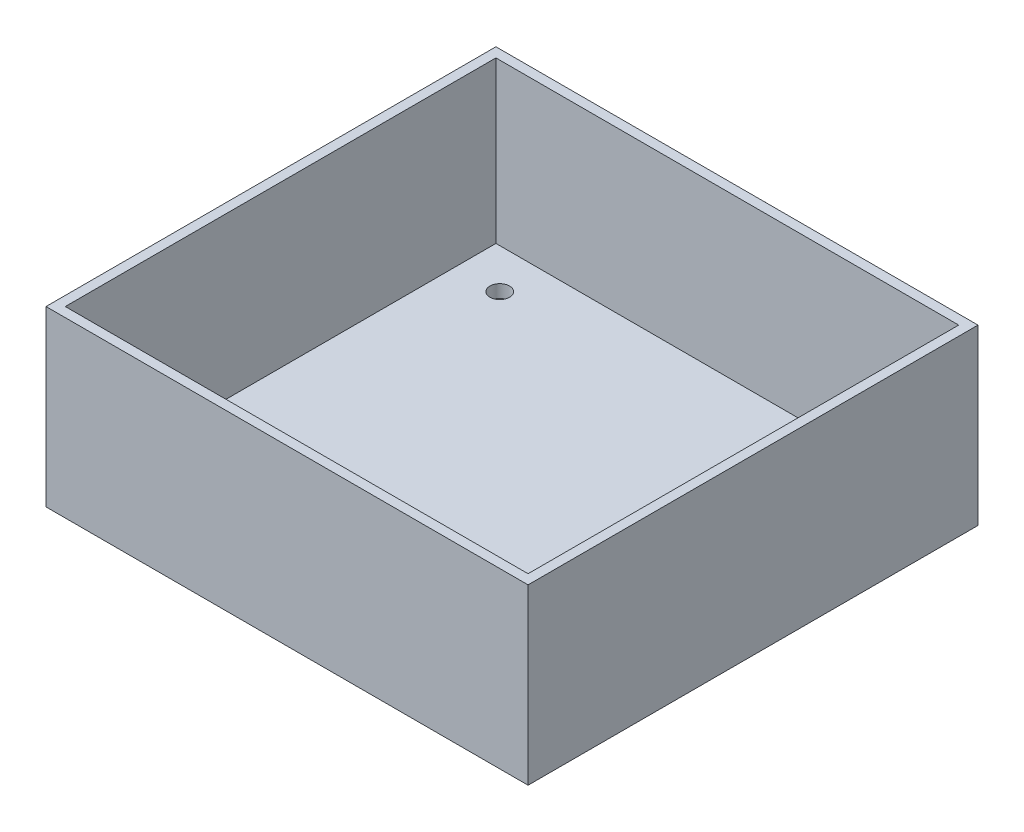
ISO-10303-21;
HEADER;
FILE_DESCRIPTION(('STEP AP214'),'2;1');
FILE_NAME('part.step','',(''),(''),'','','');
FILE_SCHEMA(('AUTOMOTIVE_DESIGN { 1 0 10303 214 1 1 1 1 }'));
ENDSEC;
DATA;
#1=APPLICATION_CONTEXT('core data for automotive mechanical design processes');
#2=APPLICATION_PROTOCOL_DEFINITION('international standard','automotive_design',2000,#1);
#3=PRODUCT_CONTEXT('',#1,'mechanical');
#4=PRODUCT('Part','Part','',(#3));
#5=PRODUCT_RELATED_PRODUCT_CATEGORY('part','',(#4));
#6=PRODUCT_DEFINITION_FORMATION('','',#4);
#7=PRODUCT_DEFINITION_CONTEXT('part definition',#1,'design');
#8=PRODUCT_DEFINITION('design','',#6,#7);
#9=PRODUCT_DEFINITION_SHAPE('','',#8);
#10=(LENGTH_UNIT() NAMED_UNIT(*) SI_UNIT(.MILLI.,.METRE.));
#11=(NAMED_UNIT(*) PLANE_ANGLE_UNIT() SI_UNIT($,.RADIAN.));
#12=(NAMED_UNIT(*) SI_UNIT($,.STERADIAN.) SOLID_ANGLE_UNIT());
#13=UNCERTAINTY_MEASURE_WITH_UNIT(LENGTH_MEASURE(1.E-05),#10,'distance_accuracy_value','');
#14=(GEOMETRIC_REPRESENTATION_CONTEXT(3) GLOBAL_UNCERTAINTY_ASSIGNED_CONTEXT((#13)) GLOBAL_UNIT_ASSIGNED_CONTEXT((#10,
#11,#12)) REPRESENTATION_CONTEXT('',''));
#15=CARTESIAN_POINT('',(0.,0.,0.));
#16=DIRECTION('',(0.,0.,1.));
#17=DIRECTION('',(1.,0.,0.));
#18=AXIS2_PLACEMENT_3D('',#15,#16,#17);
#19=CARTESIAN_POINT('',(-37.5,2.,-35.));
#20=DIRECTION('',(1.,0.,0.));
#21=DIRECTION('',(0.,0.,-1.));
#22=AXIS2_PLACEMENT_3D('',#19,#20,#21);
#23=PLANE('',#22);
#24=DIRECTION('',(0.,0.,1.));
#25=VECTOR('',#24,1.);
#26=CARTESIAN_POINT('',(-37.5,0.,-35.));
#27=LINE('',#26,#25);
#28=CARTESIAN_POINT('',(-37.5,0.,-35.));
#29=VERTEX_POINT('',#28);
#30=CARTESIAN_POINT('',(-37.5,0.,35.));
#31=VERTEX_POINT('',#30);
#32=EDGE_CURVE('E173',#29,#31,#27,.T.);
#33=ORIENTED_EDGE('',*,*,#32,.T.);
#34=DIRECTION('',(0.,-1.,0.));
#35=VECTOR('',#34,1.);
#36=CARTESIAN_POINT('',(-37.5,2.,35.));
#37=LINE('',#36,#35);
#38=CARTESIAN_POINT('',(-37.5,27.,35.));
#39=VERTEX_POINT('',#38);
#40=EDGE_CURVE('E11',#39,#31,#37,.T.);
#41=ORIENTED_EDGE('',*,*,#40,.F.);
#42=DIRECTION('',(0.,0.,1.));
#43=VECTOR('',#42,1.);
#44=CARTESIAN_POINT('',(-37.5,27.,-35.));
#45=LINE('',#44,#43);
#46=CARTESIAN_POINT('',(-37.5,27.,-35.));
#47=VERTEX_POINT('',#46);
#48=EDGE_CURVE('E124',#47,#39,#45,.T.);
#49=ORIENTED_EDGE('',*,*,#48,.F.);
#50=DIRECTION('',(0.,-1.,0.));
#51=VECTOR('',#50,1.);
#52=CARTESIAN_POINT('',(-37.5,2.,-35.));
#53=LINE('',#52,#51);
#54=EDGE_CURVE('E186',#47,#29,#53,.T.);
#55=ORIENTED_EDGE('',*,*,#54,.T.);
#56=EDGE_LOOP('',(#33,#41,#49,#55));
#57=FACE_BOUND('',#56,.T.);
#58=ADVANCED_FACE('F43',(#57),#23,.F.);
#59=CARTESIAN_POINT('',(-37.5,2.,35.));
#60=DIRECTION('',(0.,0.,-1.));
#61=DIRECTION('',(-1.,0.,0.));
#62=AXIS2_PLACEMENT_3D('',#59,#60,#61);
#63=PLANE('',#62);
#64=DIRECTION('',(1.,0.,0.));
#65=VECTOR('',#64,1.);
#66=CARTESIAN_POINT('',(-37.5,0.,35.));
#67=LINE('',#66,#65);
#68=CARTESIAN_POINT('',(37.5,0.,35.));
#69=VERTEX_POINT('',#68);
#70=EDGE_CURVE('E177',#31,#69,#67,.T.);
#71=ORIENTED_EDGE('',*,*,#70,.T.);
#72=DIRECTION('',(0.,-1.,0.));
#73=VECTOR('',#72,1.);
#74=CARTESIAN_POINT('',(37.5,2.,35.));
#75=LINE('',#74,#73);
#76=CARTESIAN_POINT('',(37.5,27.,35.));
#77=VERTEX_POINT('',#76);
#78=EDGE_CURVE('E51',#77,#69,#75,.T.);
#79=ORIENTED_EDGE('',*,*,#78,.F.);
#80=DIRECTION('',(1.,0.,0.));
#81=VECTOR('',#80,1.);
#82=CARTESIAN_POINT('',(-37.5,27.,35.));
#83=LINE('',#82,#81);
#84=EDGE_CURVE('E161',#39,#77,#83,.T.);
#85=ORIENTED_EDGE('',*,*,#84,.F.);
#86=ORIENTED_EDGE('',*,*,#40,.T.);
#87=EDGE_LOOP('',(#71,#79,#85,#86));
#88=FACE_BOUND('',#87,.T.);
#89=ADVANCED_FACE('F211',(#88),#63,.F.);
#90=CARTESIAN_POINT('',(37.5,2.,-35.));
#91=DIRECTION('',(-1.,0.,0.));
#92=DIRECTION('',(0.,0.,1.));
#93=AXIS2_PLACEMENT_3D('',#90,#91,#92);
#94=PLANE('',#93);
#95=DIRECTION('',(0.,0.,-1.));
#96=VECTOR('',#95,1.);
#97=CARTESIAN_POINT('',(37.5,0.,-35.));
#98=LINE('',#97,#96);
#99=CARTESIAN_POINT('',(37.5,0.,-35.));
#100=VERTEX_POINT('',#99);
#101=EDGE_CURVE('E180',#69,#100,#98,.T.);
#102=ORIENTED_EDGE('',*,*,#101,.T.);
#103=DIRECTION('',(0.,-1.,0.));
#104=VECTOR('',#103,1.);
#105=CARTESIAN_POINT('',(37.5,2.,-35.));
#106=LINE('',#105,#104);
#107=CARTESIAN_POINT('',(37.5,27.,-35.));
#108=VERTEX_POINT('',#107);
#109=EDGE_CURVE('E190',#108,#100,#106,.T.);
#110=ORIENTED_EDGE('',*,*,#109,.F.);
#111=DIRECTION('',(0.,0.,-1.));
#112=VECTOR('',#111,1.);
#113=CARTESIAN_POINT('',(37.5,27.,-35.));
#114=LINE('',#113,#112);
#115=EDGE_CURVE('E165',#77,#108,#114,.T.);
#116=ORIENTED_EDGE('',*,*,#115,.F.);
#117=ORIENTED_EDGE('',*,*,#78,.T.);
#118=EDGE_LOOP('',(#102,#110,#116,#117));
#119=FACE_BOUND('',#118,.T.);
#120=ADVANCED_FACE('F198',(#119),#94,.F.);
#121=CARTESIAN_POINT('',(-37.5,2.,-35.));
#122=DIRECTION('',(0.,0.,1.));
#123=DIRECTION('',(1.,0.,0.));
#124=AXIS2_PLACEMENT_3D('',#121,#122,#123);
#125=PLANE('',#124);
#126=DIRECTION('',(-1.,0.,0.));
#127=VECTOR('',#126,1.);
#128=CARTESIAN_POINT('',(-37.5,0.,-35.));
#129=LINE('',#128,#127);
#130=EDGE_CURVE('E183',#100,#29,#129,.T.);
#131=ORIENTED_EDGE('',*,*,#130,.T.);
#132=ORIENTED_EDGE('',*,*,#54,.F.);
#133=DIRECTION('',(-1.,0.,0.));
#134=VECTOR('',#133,1.);
#135=CARTESIAN_POINT('',(-37.5,27.,-35.));
#136=LINE('',#135,#134);
#137=EDGE_CURVE('E169',#108,#47,#136,.T.);
#138=ORIENTED_EDGE('',*,*,#137,.F.);
#139=ORIENTED_EDGE('',*,*,#109,.T.);
#140=EDGE_LOOP('',(#131,#132,#138,#139));
#141=FACE_BOUND('',#140,.T.);
#142=ADVANCED_FACE('F206',(#141),#125,.F.);
#143=CARTESIAN_POINT('',(0.,0.,0.));
#144=DIRECTION('',(0.,1.,0.));
#145=DIRECTION('',(0.,0.,1.));
#146=AXIS2_PLACEMENT_3D('',#143,#144,#145);
#147=PLANE('',#146);
#148=CARTESIAN_POINT('',(-29.21,0.,27.305));
#149=DIRECTION('',(0.,1.,0.));
#150=DIRECTION('',(0.,0.,1.));
#151=AXIS2_PLACEMENT_3D('',#148,#149,#150);
#152=CIRCLE('',#151,1.525);
#153=CARTESIAN_POINT('',(-29.21,0.,28.83));
#154=VERTEX_POINT('',#153);
#155=EDGE_CURVE('E142',#154,#154,#152,.T.);
#156=ORIENTED_EDGE('',*,*,#155,.T.);
#157=EDGE_LOOP('',(#156));
#158=FACE_BOUND('',#157,.T.);
#159=CARTESIAN_POINT('',(29.21,0.,-27.305));
#160=DIRECTION('',(0.,1.,0.));
#161=DIRECTION('',(0.,0.,1.));
#162=AXIS2_PLACEMENT_3D('',#159,#160,#161);
#163=CIRCLE('',#162,1.525);
#164=CARTESIAN_POINT('',(29.21,0.,-25.78));
#165=VERTEX_POINT('',#164);
#166=EDGE_CURVE('E268',#165,#165,#163,.T.);
#167=ORIENTED_EDGE('',*,*,#166,.T.);
#168=EDGE_LOOP('',(#167));
#169=FACE_BOUND('',#168,.T.);
#170=CARTESIAN_POINT('',(29.2099999999967,0.,27.3049804999527));
#171=DIRECTION('',(0.,1.,0.));
#172=DIRECTION('',(0.,0.,1.));
#173=AXIS2_PLACEMENT_3D('',#170,#171,#172);
#174=CIRCLE('',#173,1.525);
#175=CARTESIAN_POINT('',(29.2099999999967,0.,28.8299804999527));
#176=VERTEX_POINT('',#175);
#177=EDGE_CURVE('E265',#176,#176,#174,.T.);
#178=ORIENTED_EDGE('',*,*,#177,.T.);
#179=EDGE_LOOP('',(#178));
#180=FACE_BOUND('',#179,.T.);
#181=CARTESIAN_POINT('',(-29.21,0.,-27.305));
#182=DIRECTION('',(0.,1.,0.));
#183=DIRECTION('',(0.,0.,1.));
#184=AXIS2_PLACEMENT_3D('',#181,#182,#183);
#185=CIRCLE('',#184,1.525);
#186=CARTESIAN_POINT('',(-29.21,0.,-25.78));
#187=VERTEX_POINT('',#186);
#188=EDGE_CURVE('E269',#187,#187,#185,.T.);
#189=ORIENTED_EDGE('',*,*,#188,.T.);
#190=EDGE_LOOP('',(#189));
#191=FACE_BOUND('',#190,.T.);
#192=ORIENTED_EDGE('',*,*,#32,.F.);
#193=ORIENTED_EDGE('',*,*,#130,.F.);
#194=ORIENTED_EDGE('',*,*,#101,.F.);
#195=ORIENTED_EDGE('',*,*,#70,.F.);
#196=EDGE_LOOP('',(#192,#193,#194,#195));
#197=FACE_BOUND('',#196,.T.);
#198=ADVANCED_FACE('F204',(#158,#169,#180,#191,#197),#147,.F.);
#199=CARTESIAN_POINT('',(0.,27.,0.));
#200=DIRECTION('',(0.,1.,0.));
#201=DIRECTION('',(0.,0.,1.));
#202=AXIS2_PLACEMENT_3D('',#199,#200,#201);
#203=PLANE('',#202);
#204=ORIENTED_EDGE('',*,*,#48,.T.);
#205=ORIENTED_EDGE('',*,*,#84,.T.);
#206=ORIENTED_EDGE('',*,*,#115,.T.);
#207=ORIENTED_EDGE('',*,*,#137,.T.);
#208=EDGE_LOOP('',(#204,#205,#206,#207));
#209=FACE_BOUND('',#208,.T.);
#210=DIRECTION('',(1.,0.,0.));
#211=VECTOR('',#210,1.);
#212=CARTESIAN_POINT('',(-36.,27.,33.5));
#213=LINE('',#212,#211);
#214=CARTESIAN_POINT('',(-36.,27.,33.5));
#215=VERTEX_POINT('',#214);
#216=CARTESIAN_POINT('',(36.,27.,33.5));
#217=VERTEX_POINT('',#216);
#218=EDGE_CURVE('E117',#215,#217,#213,.T.);
#219=ORIENTED_EDGE('',*,*,#218,.F.);
#220=DIRECTION('',(0.,0.,1.));
#221=VECTOR('',#220,1.);
#222=CARTESIAN_POINT('',(-36.,27.,-33.5));
#223=LINE('',#222,#221);
#224=CARTESIAN_POINT('',(-36.,27.,-33.5));
#225=VERTEX_POINT('',#224);
#226=EDGE_CURVE('E107',#225,#215,#223,.T.);
#227=ORIENTED_EDGE('',*,*,#226,.F.);
#228=DIRECTION('',(-1.,0.,0.));
#229=VECTOR('',#228,1.);
#230=CARTESIAN_POINT('',(-36.,27.,-33.5));
#231=LINE('',#230,#229);
#232=CARTESIAN_POINT('',(36.,27.,-33.5));
#233=VERTEX_POINT('',#232);
#234=EDGE_CURVE('E134',#233,#225,#231,.T.);
#235=ORIENTED_EDGE('',*,*,#234,.F.);
#236=DIRECTION('',(0.,0.,-1.));
#237=VECTOR('',#236,1.);
#238=CARTESIAN_POINT('',(36.,27.,-33.5));
#239=LINE('',#238,#237);
#240=EDGE_CURVE('E130',#217,#233,#239,.T.);
#241=ORIENTED_EDGE('',*,*,#240,.F.);
#242=EDGE_LOOP('',(#219,#227,#235,#241));
#243=FACE_BOUND('',#242,.T.);
#244=ADVANCED_FACE('F128',(#209,#243),#203,.T.);
#245=CARTESIAN_POINT('',(-36.,27.,-33.5));
#246=DIRECTION('',(1.,0.,0.));
#247=DIRECTION('',(0.,0.,-1.));
#248=AXIS2_PLACEMENT_3D('',#245,#246,#247);
#249=PLANE('',#248);
#250=DIRECTION('',(0.,0.,1.));
#251=VECTOR('',#250,1.);
#252=CARTESIAN_POINT('',(-36.,2.,-33.5));
#253=LINE('',#252,#251);
#254=CARTESIAN_POINT('',(-36.,2.,-33.5));
#255=VERTEX_POINT('',#254);
#256=CARTESIAN_POINT('',(-36.,2.,33.5));
#257=VERTEX_POINT('',#256);
#258=EDGE_CURVE('E58',#255,#257,#253,.T.);
#259=ORIENTED_EDGE('',*,*,#258,.F.);
#260=DIRECTION('',(0.,-1.,0.));
#261=VECTOR('',#260,1.);
#262=CARTESIAN_POINT('',(-36.,27.,-33.5));
#263=LINE('',#262,#261);
#264=EDGE_CURVE('E112',#225,#255,#263,.T.);
#265=ORIENTED_EDGE('',*,*,#264,.F.);
#266=ORIENTED_EDGE('',*,*,#226,.T.);
#267=DIRECTION('',(0.,-1.,0.));
#268=VECTOR('',#267,1.);
#269=CARTESIAN_POINT('',(-36.,27.,33.5));
#270=LINE('',#269,#268);
#271=EDGE_CURVE('E110',#215,#257,#270,.T.);
#272=ORIENTED_EDGE('',*,*,#271,.T.);
#273=EDGE_LOOP('',(#259,#265,#266,#272));
#274=FACE_BOUND('',#273,.T.);
#275=ADVANCED_FACE('F109',(#274),#249,.T.);
#276=CARTESIAN_POINT('',(-36.,27.,33.5));
#277=DIRECTION('',(0.,0.,-1.));
#278=DIRECTION('',(-1.,0.,0.));
#279=AXIS2_PLACEMENT_3D('',#276,#277,#278);
#280=PLANE('',#279);
#281=DIRECTION('',(1.,0.,0.));
#282=VECTOR('',#281,1.);
#283=CARTESIAN_POINT('',(-36.,2.,33.5));
#284=LINE('',#283,#282);
#285=CARTESIAN_POINT('',(36.,2.,33.5));
#286=VERTEX_POINT('',#285);
#287=EDGE_CURVE('E62',#257,#286,#284,.T.);
#288=ORIENTED_EDGE('',*,*,#287,.F.);
#289=ORIENTED_EDGE('',*,*,#271,.F.);
#290=ORIENTED_EDGE('',*,*,#218,.T.);
#291=DIRECTION('',(0.,-1.,0.));
#292=VECTOR('',#291,1.);
#293=CARTESIAN_POINT('',(36.,27.,33.5));
#294=LINE('',#293,#292);
#295=EDGE_CURVE('E125',#217,#286,#294,.T.);
#296=ORIENTED_EDGE('',*,*,#295,.T.);
#297=EDGE_LOOP('',(#288,#289,#290,#296));
#298=FACE_BOUND('',#297,.T.);
#299=ADVANCED_FACE('F121',(#298),#280,.T.);
#300=CARTESIAN_POINT('',(36.,27.,-33.5));
#301=DIRECTION('',(-1.,0.,0.));
#302=DIRECTION('',(0.,0.,1.));
#303=AXIS2_PLACEMENT_3D('',#300,#301,#302);
#304=PLANE('',#303);
#305=DIRECTION('',(0.,0.,-1.));
#306=VECTOR('',#305,1.);
#307=CARTESIAN_POINT('',(36.,2.,-33.5));
#308=LINE('',#307,#306);
#309=CARTESIAN_POINT('',(36.,2.,-33.5));
#310=VERTEX_POINT('',#309);
#311=EDGE_CURVE('E145',#286,#310,#308,.T.);
#312=ORIENTED_EDGE('',*,*,#311,.F.);
#313=ORIENTED_EDGE('',*,*,#295,.F.);
#314=ORIENTED_EDGE('',*,*,#240,.T.);
#315=DIRECTION('',(0.,-1.,0.));
#316=VECTOR('',#315,1.);
#317=CARTESIAN_POINT('',(36.,27.,-33.5));
#318=LINE('',#317,#316);
#319=EDGE_CURVE('E152',#233,#310,#318,.T.);
#320=ORIENTED_EDGE('',*,*,#319,.T.);
#321=EDGE_LOOP('',(#312,#313,#314,#320));
#322=FACE_BOUND('',#321,.T.);
#323=ADVANCED_FACE('F236',(#322),#304,.T.);
#324=CARTESIAN_POINT('',(-36.,27.,-33.5));
#325=DIRECTION('',(0.,0.,1.));
#326=DIRECTION('',(1.,0.,0.));
#327=AXIS2_PLACEMENT_3D('',#324,#325,#326);
#328=PLANE('',#327);
#329=DIRECTION('',(-1.,0.,0.));
#330=VECTOR('',#329,1.);
#331=CARTESIAN_POINT('',(-36.,2.,-33.5));
#332=LINE('',#331,#330);
#333=EDGE_CURVE('E118',#310,#255,#332,.T.);
#334=ORIENTED_EDGE('',*,*,#333,.F.);
#335=ORIENTED_EDGE('',*,*,#319,.F.);
#336=ORIENTED_EDGE('',*,*,#234,.T.);
#337=ORIENTED_EDGE('',*,*,#264,.T.);
#338=EDGE_LOOP('',(#334,#335,#336,#337));
#339=FACE_BOUND('',#338,.T.);
#340=ADVANCED_FACE('F228',(#339),#328,.T.);
#341=CARTESIAN_POINT('',(0.,2.,0.));
#342=DIRECTION('',(0.,1.,0.));
#343=DIRECTION('',(0.,0.,1.));
#344=AXIS2_PLACEMENT_3D('',#341,#342,#343);
#345=PLANE('',#344);
#346=CARTESIAN_POINT('',(-29.21,2.,27.305));
#347=DIRECTION('',(0.,1.,0.));
#348=DIRECTION('',(0.,0.,1.));
#349=AXIS2_PLACEMENT_3D('',#346,#347,#348);
#350=CIRCLE('',#349,1.525);
#351=CARTESIAN_POINT('',(-29.21,2.,28.83));
#352=VERTEX_POINT('',#351);
#353=EDGE_CURVE('E292',#352,#352,#350,.T.);
#354=ORIENTED_EDGE('',*,*,#353,.F.);
#355=EDGE_LOOP('',(#354));
#356=FACE_BOUND('',#355,.T.);
#357=CARTESIAN_POINT('',(29.21,2.,-27.305));
#358=DIRECTION('',(0.,1.,0.));
#359=DIRECTION('',(0.,0.,1.));
#360=AXIS2_PLACEMENT_3D('',#357,#358,#359);
#361=CIRCLE('',#360,1.525);
#362=CARTESIAN_POINT('',(29.21,2.,-25.78));
#363=VERTEX_POINT('',#362);
#364=EDGE_CURVE('E293',#363,#363,#361,.T.);
#365=ORIENTED_EDGE('',*,*,#364,.F.);
#366=EDGE_LOOP('',(#365));
#367=FACE_BOUND('',#366,.T.);
#368=CARTESIAN_POINT('',(29.2099999999967,2.,27.3049804999527));
#369=DIRECTION('',(0.,1.,0.));
#370=DIRECTION('',(0.,0.,1.));
#371=AXIS2_PLACEMENT_3D('',#368,#369,#370);
#372=CIRCLE('',#371,1.525);
#373=CARTESIAN_POINT('',(29.2099999999967,2.,28.8299804999527));
#374=VERTEX_POINT('',#373);
#375=EDGE_CURVE('E262',#374,#374,#372,.T.);
#376=ORIENTED_EDGE('',*,*,#375,.F.);
#377=EDGE_LOOP('',(#376));
#378=FACE_BOUND('',#377,.T.);
#379=CARTESIAN_POINT('',(-29.21,2.,-27.305));
#380=DIRECTION('',(0.,1.,0.));
#381=DIRECTION('',(0.,0.,1.));
#382=AXIS2_PLACEMENT_3D('',#379,#380,#381);
#383=CIRCLE('',#382,1.525);
#384=CARTESIAN_POINT('',(-29.21,2.,-25.78));
#385=VERTEX_POINT('',#384);
#386=EDGE_CURVE('E276',#385,#385,#383,.T.);
#387=ORIENTED_EDGE('',*,*,#386,.F.);
#388=EDGE_LOOP('',(#387));
#389=FACE_BOUND('',#388,.T.);
#390=ORIENTED_EDGE('',*,*,#258,.T.);
#391=ORIENTED_EDGE('',*,*,#287,.T.);
#392=ORIENTED_EDGE('',*,*,#311,.T.);
#393=ORIENTED_EDGE('',*,*,#333,.T.);
#394=EDGE_LOOP('',(#390,#391,#392,#393));
#395=FACE_BOUND('',#394,.T.);
#396=ADVANCED_FACE('F224',(#356,#367,#378,#389,#395),#345,.T.);
#397=CARTESIAN_POINT('',(-29.21,-8.,-27.305));
#398=DIRECTION('',(0.,1.,0.));
#399=DIRECTION('',(0.,0.,1.));
#400=AXIS2_PLACEMENT_3D('',#397,#398,#399);
#401=CYLINDRICAL_SURFACE('',#400,1.525);
#402=ORIENTED_EDGE('',*,*,#386,.T.);
#403=EDGE_LOOP('',(#402));
#404=FACE_BOUND('',#403,.T.);
#405=ORIENTED_EDGE('',*,*,#188,.F.);
#406=EDGE_LOOP('',(#405));
#407=FACE_BOUND('',#406,.T.);
#408=ADVANCED_FACE('F227',(#404,#407),#401,.F.);
#409=CARTESIAN_POINT('',(29.2099999999967,-8.,27.3049804999527));
#410=DIRECTION('',(0.,1.,0.));
#411=DIRECTION('',(0.,0.,1.));
#412=AXIS2_PLACEMENT_3D('',#409,#410,#411);
#413=CYLINDRICAL_SURFACE('',#412,1.525);
#414=ORIENTED_EDGE('',*,*,#375,.T.);
#415=EDGE_LOOP('',(#414));
#416=FACE_BOUND('',#415,.T.);
#417=ORIENTED_EDGE('',*,*,#177,.F.);
#418=EDGE_LOOP('',(#417));
#419=FACE_BOUND('',#418,.T.);
#420=ADVANCED_FACE('F245',(#416,#419),#413,.F.);
#421=CARTESIAN_POINT('',(29.21,-8.,-27.305));
#422=DIRECTION('',(0.,1.,0.));
#423=DIRECTION('',(0.,0.,1.));
#424=AXIS2_PLACEMENT_3D('',#421,#422,#423);
#425=CYLINDRICAL_SURFACE('',#424,1.525);
#426=ORIENTED_EDGE('',*,*,#364,.T.);
#427=EDGE_LOOP('',(#426));
#428=FACE_BOUND('',#427,.T.);
#429=ORIENTED_EDGE('',*,*,#166,.F.);
#430=EDGE_LOOP('',(#429));
#431=FACE_BOUND('',#430,.T.);
#432=ADVANCED_FACE('F247',(#428,#431),#425,.F.);
#433=CARTESIAN_POINT('',(-29.21,-8.,27.305));
#434=DIRECTION('',(0.,1.,0.));
#435=DIRECTION('',(0.,0.,1.));
#436=AXIS2_PLACEMENT_3D('',#433,#434,#435);
#437=CYLINDRICAL_SURFACE('',#436,1.525);
#438=ORIENTED_EDGE('',*,*,#353,.T.);
#439=EDGE_LOOP('',(#438));
#440=FACE_BOUND('',#439,.T.);
#441=ORIENTED_EDGE('',*,*,#155,.F.);
#442=EDGE_LOOP('',(#441));
#443=FACE_BOUND('',#442,.T.);
#444=ADVANCED_FACE('F250',(#440,#443),#437,.F.);
#445=CLOSED_SHELL('',(#58,#89,#120,#142,#198,#244,#275,#299,#323,#340,#396,#408,#420,#432,#444));
#446=MANIFOLD_SOLID_BREP('B2',#445);
#447=ADVANCED_BREP_SHAPE_REPRESENTATION('',(#18,#446),#14);
#448=SHAPE_DEFINITION_REPRESENTATION(#9,#447);
ENDSEC;
END-ISO-10303-21;
